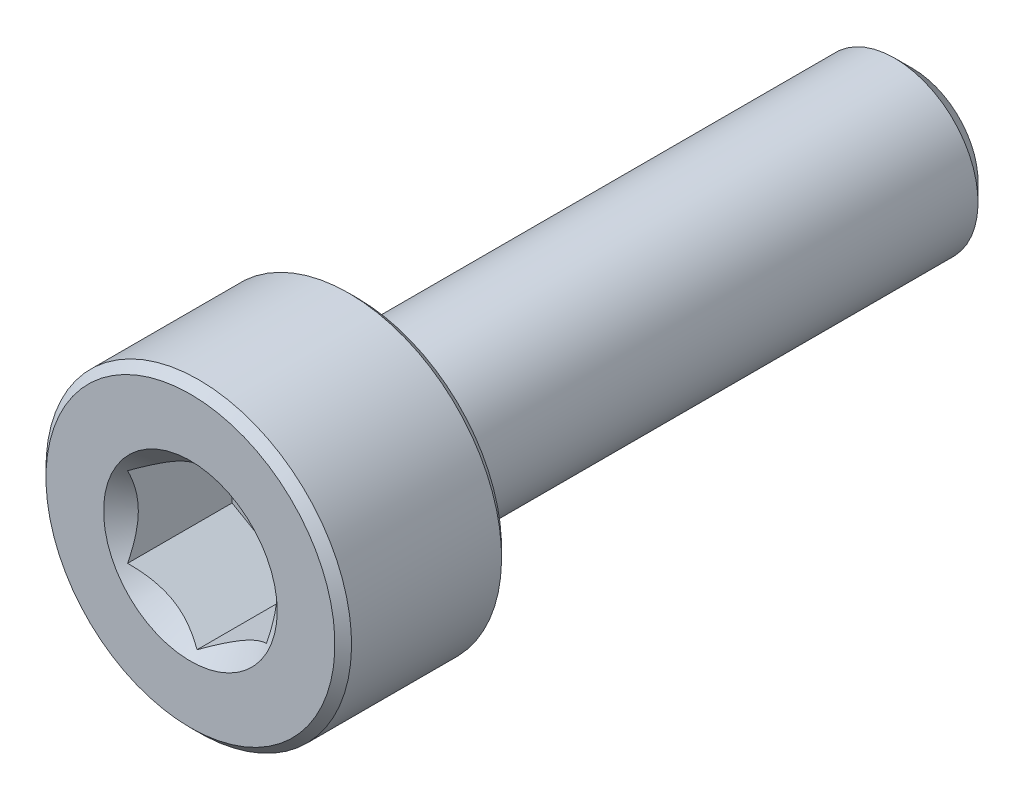
ISO-10303-21;
HEADER;
FILE_DESCRIPTION(('STEP AP214'),'2;1');
FILE_NAME('part.step','',(''),(''),'','','');
FILE_SCHEMA(('AUTOMOTIVE_DESIGN { 1 0 10303 214 1 1 1 1 }'));
ENDSEC;
DATA;
#1=APPLICATION_CONTEXT('core data for automotive mechanical design processes');
#2=APPLICATION_PROTOCOL_DEFINITION('international standard','automotive_design',2000,#1);
#3=PRODUCT_CONTEXT('',#1,'mechanical');
#4=PRODUCT('Part','Part','',(#3));
#5=PRODUCT_RELATED_PRODUCT_CATEGORY('part','',(#4));
#6=PRODUCT_DEFINITION_FORMATION('','',#4);
#7=PRODUCT_DEFINITION_CONTEXT('part definition',#1,'design');
#8=PRODUCT_DEFINITION('design','',#6,#7);
#9=PRODUCT_DEFINITION_SHAPE('','',#8);
#10=(LENGTH_UNIT() NAMED_UNIT(*) SI_UNIT(.MILLI.,.METRE.));
#11=(NAMED_UNIT(*) PLANE_ANGLE_UNIT() SI_UNIT($,.RADIAN.));
#12=(NAMED_UNIT(*) SI_UNIT($,.STERADIAN.) SOLID_ANGLE_UNIT());
#13=UNCERTAINTY_MEASURE_WITH_UNIT(LENGTH_MEASURE(1.E-05),#10,'distance_accuracy_value','');
#14=(GEOMETRIC_REPRESENTATION_CONTEXT(3) GLOBAL_UNCERTAINTY_ASSIGNED_CONTEXT((#13)) GLOBAL_UNIT_ASSIGNED_CONTEXT((#10,
#11,#12)) REPRESENTATION_CONTEXT('',''));
#15=CARTESIAN_POINT('',(0.,0.,0.));
#16=DIRECTION('',(0.,0.,1.));
#17=DIRECTION('',(1.,0.,0.));
#18=AXIS2_PLACEMENT_3D('',#15,#16,#17);
#19=CARTESIAN_POINT('',(0.,1.17524047358084,-6.5));
#20=DIRECTION('',(0.,0.,-1.));
#21=DIRECTION('',(0.,1.,0.));
#22=AXIS2_PLACEMENT_3D('',#19,#20,#21);
#23=PLANE('',#22);
#24=CARTESIAN_POINT('',(0.,0.,-6.5));
#25=DIRECTION('',(0.,0.,-1.));
#26=DIRECTION('',(0.,1.,0.));
#27=AXIS2_PLACEMENT_3D('',#24,#25,#26);
#28=CIRCLE('',#27,1.17524047358084);
#29=CARTESIAN_POINT('',(0.,1.17524047358084,-6.5));
#30=VERTEX_POINT('',#29);
#31=EDGE_CURVE('E55',#30,#30,#28,.T.);
#32=ORIENTED_EDGE('',*,*,#31,.T.);
#33=EDGE_LOOP('',(#32));
#34=FACE_BOUND('',#33,.T.);
#35=ADVANCED_FACE('F42',(#34),#23,.T.);
#36=CARTESIAN_POINT('',(0.,0.,-6.5));
#37=DIRECTION('',(0.,0.,1.));
#38=DIRECTION('',(0.,-1.,0.));
#39=AXIS2_PLACEMENT_3D('',#36,#37,#38);
#40=CONICAL_SURFACE('',#39,1.17524047358084,0.785398163397448);
#41=CARTESIAN_POINT('',(0.,0.,-6.17524047358084));
#42=DIRECTION('',(0.,0.,-1.));
#43=DIRECTION('',(0.,1.,0.));
#44=AXIS2_PLACEMENT_3D('',#41,#42,#43);
#45=CIRCLE('',#44,1.5);
#46=CARTESIAN_POINT('',(0.,1.5,-6.17524047358084));
#47=VERTEX_POINT('',#46);
#48=EDGE_CURVE('E158',#47,#47,#45,.T.);
#49=ORIENTED_EDGE('',*,*,#48,.T.);
#50=EDGE_LOOP('',(#49));
#51=FACE_BOUND('',#50,.T.);
#52=ORIENTED_EDGE('',*,*,#31,.F.);
#53=EDGE_LOOP('',(#52));
#54=FACE_BOUND('',#53,.T.);
#55=ADVANCED_FACE('F164',(#51,#54),#40,.T.);
#56=CARTESIAN_POINT('',(0.,0.,-6.5));
#57=DIRECTION('',(0.,0.,-1.));
#58=DIRECTION('',(0.,1.,0.));
#59=AXIS2_PLACEMENT_3D('',#56,#57,#58);
#60=CYLINDRICAL_SURFACE('',#59,1.5);
#61=CARTESIAN_POINT('',(0.,0.,3.35));
#62=DIRECTION('',(0.,0.,-1.));
#63=DIRECTION('',(0.,1.,0.));
#64=AXIS2_PLACEMENT_3D('',#61,#62,#63);
#65=CIRCLE('',#64,1.5);
#66=CARTESIAN_POINT('',(0.,1.5,3.35));
#67=VERTEX_POINT('',#66);
#68=EDGE_CURVE('E155',#67,#67,#65,.T.);
#69=ORIENTED_EDGE('',*,*,#68,.T.);
#70=EDGE_LOOP('',(#69));
#71=FACE_BOUND('',#70,.T.);
#72=ORIENTED_EDGE('',*,*,#48,.F.);
#73=EDGE_LOOP('',(#72));
#74=FACE_BOUND('',#73,.T.);
#75=ADVANCED_FACE('F166',(#71,#74),#60,.T.);
#76=CARTESIAN_POINT('',(0.,0.,3.35));
#77=DIRECTION('',(0.,0.,-1.));
#78=DIRECTION('',(0.,1.,0.));
#79=AXIS2_PLACEMENT_3D('',#76,#77,#78);
#80=TOROIDAL_SURFACE('',#79,1.65,0.15);
#81=CARTESIAN_POINT('',(0.,0.,3.5));
#82=DIRECTION('',(0.,0.,-1.));
#83=DIRECTION('',(0.,1.,0.));
#84=AXIS2_PLACEMENT_3D('',#81,#82,#83);
#85=CIRCLE('',#84,1.65);
#86=CARTESIAN_POINT('',(0.,1.65,3.5));
#87=VERTEX_POINT('',#86);
#88=EDGE_CURVE('E152',#87,#87,#85,.T.);
#89=ORIENTED_EDGE('',*,*,#88,.T.);
#90=EDGE_LOOP('',(#89));
#91=FACE_BOUND('',#90,.T.);
#92=ORIENTED_EDGE('',*,*,#68,.F.);
#93=EDGE_LOOP('',(#92));
#94=FACE_BOUND('',#93,.T.);
#95=ADVANCED_FACE('F172',(#91,#94),#80,.F.);
#96=CARTESIAN_POINT('',(0.,2.6,3.5));
#97=DIRECTION('',(0.,0.,-1.));
#98=DIRECTION('',(0.,1.,0.));
#99=AXIS2_PLACEMENT_3D('',#96,#97,#98);
#100=PLANE('',#99);
#101=CARTESIAN_POINT('',(0.,0.,3.5));
#102=DIRECTION('',(0.,0.,-1.));
#103=DIRECTION('',(0.,1.,0.));
#104=AXIS2_PLACEMENT_3D('',#101,#102,#103);
#105=CIRCLE('',#104,2.6);
#106=CARTESIAN_POINT('',(0.,2.6,3.5));
#107=VERTEX_POINT('',#106);
#108=EDGE_CURVE('E149',#107,#107,#105,.T.);
#109=ORIENTED_EDGE('',*,*,#108,.T.);
#110=EDGE_LOOP('',(#109));
#111=FACE_BOUND('',#110,.T.);
#112=ORIENTED_EDGE('',*,*,#88,.F.);
#113=EDGE_LOOP('',(#112));
#114=FACE_BOUND('',#113,.T.);
#115=ADVANCED_FACE('F178',(#111,#114),#100,.T.);
#116=CARTESIAN_POINT('',(0.,0.,3.5));
#117=DIRECTION('',(0.,0.,1.));
#118=DIRECTION('',(0.,-1.,0.));
#119=AXIS2_PLACEMENT_3D('',#116,#117,#118);
#120=CONICAL_SURFACE('',#119,2.6,0.785398163397445);
#121=CARTESIAN_POINT('',(0.,0.,3.65));
#122=DIRECTION('',(0.,0.,-1.));
#123=DIRECTION('',(0.,1.,0.));
#124=AXIS2_PLACEMENT_3D('',#121,#122,#123);
#125=CIRCLE('',#124,2.75);
#126=CARTESIAN_POINT('',(0.,2.75,3.65));
#127=VERTEX_POINT('',#126);
#128=EDGE_CURVE('E146',#127,#127,#125,.T.);
#129=ORIENTED_EDGE('',*,*,#128,.T.);
#130=EDGE_LOOP('',(#129));
#131=FACE_BOUND('',#130,.T.);
#132=ORIENTED_EDGE('',*,*,#108,.F.);
#133=EDGE_LOOP('',(#132));
#134=FACE_BOUND('',#133,.T.);
#135=ADVANCED_FACE('F182',(#131,#134),#120,.T.);
#136=CARTESIAN_POINT('',(0.,0.,-6.5));
#137=DIRECTION('',(0.,0.,-1.));
#138=DIRECTION('',(0.,1.,0.));
#139=AXIS2_PLACEMENT_3D('',#136,#137,#138);
#140=CYLINDRICAL_SURFACE('',#139,2.75);
#141=CARTESIAN_POINT('',(0.,0.,6.35));
#142=DIRECTION('',(0.,0.,-1.));
#143=DIRECTION('',(0.,1.,0.));
#144=AXIS2_PLACEMENT_3D('',#141,#142,#143);
#145=CIRCLE('',#144,2.75);
#146=CARTESIAN_POINT('',(0.,2.75,6.35));
#147=VERTEX_POINT('',#146);
#148=EDGE_CURVE('E143',#147,#147,#145,.T.);
#149=ORIENTED_EDGE('',*,*,#148,.T.);
#150=EDGE_LOOP('',(#149));
#151=FACE_BOUND('',#150,.T.);
#152=ORIENTED_EDGE('',*,*,#128,.F.);
#153=EDGE_LOOP('',(#152));
#154=FACE_BOUND('',#153,.T.);
#155=ADVANCED_FACE('F186',(#151,#154),#140,.T.);
#156=CARTESIAN_POINT('',(0.,0.,6.35));
#157=DIRECTION('',(0.,0.,-1.));
#158=DIRECTION('',(0.,1.,0.));
#159=AXIS2_PLACEMENT_3D('',#156,#157,#158);
#160=CONICAL_SURFACE('',#159,2.75,0.785398163397451);
#161=CARTESIAN_POINT('',(0.,0.,6.5));
#162=DIRECTION('',(0.,0.,-1.));
#163=DIRECTION('',(0.,1.,0.));
#164=AXIS2_PLACEMENT_3D('',#161,#162,#163);
#165=CIRCLE('',#164,2.6);
#166=CARTESIAN_POINT('',(0.,2.6,6.5));
#167=VERTEX_POINT('',#166);
#168=EDGE_CURVE('E140',#167,#167,#165,.T.);
#169=ORIENTED_EDGE('',*,*,#168,.T.);
#170=EDGE_LOOP('',(#169));
#171=FACE_BOUND('',#170,.T.);
#172=ORIENTED_EDGE('',*,*,#148,.F.);
#173=EDGE_LOOP('',(#172));
#174=FACE_BOUND('',#173,.T.);
#175=ADVANCED_FACE('F190',(#171,#174),#160,.T.);
#176=CARTESIAN_POINT('',(0.,0.,6.5));
#177=DIRECTION('',(0.,0.,1.));
#178=DIRECTION('',(0.,-1.,0.));
#179=AXIS2_PLACEMENT_3D('',#176,#177,#178);
#180=PLANE('',#179);
#181=CARTESIAN_POINT('',(0.,0.,6.5));
#182=DIRECTION('',(0.,0.,1.));
#183=DIRECTION('',(1.,0.,0.));
#184=AXIS2_PLACEMENT_3D('',#181,#182,#183);
#185=CIRCLE('',#184,1.5625);
#186=CARTESIAN_POINT('',(1.5625,0.,6.5));
#187=VERTEX_POINT('',#186);
#188=EDGE_CURVE('E114',#187,#187,#185,.T.);
#189=ORIENTED_EDGE('',*,*,#188,.F.);
#190=EDGE_LOOP('',(#189));
#191=FACE_BOUND('',#190,.T.);
#192=ORIENTED_EDGE('',*,*,#168,.F.);
#193=EDGE_LOOP('',(#192));
#194=FACE_BOUND('',#193,.T.);
#195=ADVANCED_FACE('F194',(#191,#194),#180,.T.);
#196=CARTESIAN_POINT('',(0.,0.,6.5));
#197=DIRECTION('',(0.,0.,1.));
#198=DIRECTION('',(1.,0.,0.));
#199=AXIS2_PLACEMENT_3D('',#196,#197,#198);
#200=CONICAL_SURFACE('',#199,1.5625,0.78539816339745);
#201=ORIENTED_EDGE('',*,*,#188,.T.);
#202=EDGE_LOOP('',(#201));
#203=FACE_BOUND('',#202,.T.);
#204=CARTESIAN_POINT('',(-0.000200000000000217,-1.4434911430279,6.3809911568832));
#205=CARTESIAN_POINT('',(0.0427751670715865,-1.41867941875065,6.35619734102917));
#206=CARTESIAN_POINT('',(0.0864690047459478,-1.39345276980743,6.33285940739275));
#207=CARTESIAN_POINT('',(0.175565930841942,-1.34201263554194,6.2901276770586));
#208=CARTESIAN_POINT('',(0.220977498357064,-1.31579425481276,6.27075766533448));
#209=CARTESIAN_POINT('',(0.312547820935259,-1.26292610442246,6.23757615638754));
#210=CARTESIAN_POINT('',(0.358683240175885,-1.23628980770471,6.22368123202672));
#211=CARTESIAN_POINT('',(0.451970080407592,-1.18243062538508,6.2022729551347));
#212=CARTESIAN_POINT('',(0.49911864913638,-1.15520938653761,6.19474361454085));
#213=CARTESIAN_POINT('',(0.580373556887252,-1.10829684367467,6.18795017102477));
#214=CARTESIAN_POINT('',(0.614374876627941,-1.08866617256958,6.18694423207842));
#215=CARTESIAN_POINT('',(0.682317764432477,-1.04943932800611,6.18863708788538));
#216=CARTESIAN_POINT('',(0.716259317655657,-1.02984316311599,6.1913367001896));
#217=CARTESIAN_POINT('',(0.783814856457499,-0.990839954603499,6.20028460329044));
#218=CARTESIAN_POINT('',(0.817428507286775,-0.971433104248771,6.20653619887377));
#219=CARTESIAN_POINT('',(0.884094638217813,-0.932943395609905,6.22225135438797));
#220=CARTESIAN_POINT('',(0.917146871030295,-0.9138606800983,6.23171629306152));
#221=CARTESIAN_POINT('',(1.00179969160026,-0.864986351354568,6.25980706366165));
#222=CARTESIAN_POINT('',(1.05286649242964,-0.835502920149076,6.28054583042627));
#223=CARTESIAN_POINT('',(1.15300085411325,-0.777690319475909,6.32726280764554));
#224=CARTESIAN_POINT('',(1.20207431157827,-0.749357745598417,6.35322396892083));
#225=CARTESIAN_POINT('',(1.2502,-0.721572366433195,6.3809911568832));
#226=B_SPLINE_CURVE_WITH_KNOTS('',3,(#204,#205,#206,#207,#208,#209,#210,#211,#212,#213,#214,
#215,#216,#217,#218,#219,#220,#221,#222,#223,#224,#225),.UNSPECIFIED.,.F.,.F.,(4,2,2,2,2,2,2,2,
2,2,4),(0.,0.166533409618304,0.334037607289762,0.498880396489698,0.663307919240275,
0.780963963458827,0.898645970148453,1.01643764860773,1.1342799317155,1.32148652032141,
1.50809158792574),.UNSPECIFIED.);
#227=CARTESIAN_POINT('',(0.,-1.44337567297406,6.38087567297407));
#228=VERTEX_POINT('',#227);
#229=CARTESIAN_POINT('',(1.25,-0.721687836487032,6.38087567297406));
#230=VERTEX_POINT('',#229);
#231=EDGE_CURVE('E12',#228,#230,#226,.T.);
#232=ORIENTED_EDGE('',*,*,#231,.F.);
#233=CARTESIAN_POINT('',(-1.2502,-0.721572366433195,6.3809911568832));
#234=CARTESIAN_POINT('',(-1.20722483292841,-0.746384090710444,6.35619734102917));
#235=CARTESIAN_POINT('',(-1.16353099525405,-0.771610739653665,6.33285940739275));
#236=CARTESIAN_POINT('',(-1.07443406915806,-0.823050873919155,6.2901276770586));
#237=CARTESIAN_POINT('',(-1.02902250164294,-0.849269254648333,6.27075766533448));
#238=CARTESIAN_POINT('',(-0.937452179064741,-0.902137405038636,6.23757615638754));
#239=CARTESIAN_POINT('',(-0.891316759824115,-0.928773701756387,6.22368123202672));
#240=CARTESIAN_POINT('',(-0.798029919592408,-0.982632884076013,6.2022729551347));
#241=CARTESIAN_POINT('',(-0.750881350863621,-1.00985412292348,6.19474361454085));
#242=CARTESIAN_POINT('',(-0.669626443112748,-1.05676666578643,6.18795017102477));
#243=CARTESIAN_POINT('',(-0.63562512337206,-1.07639733689152,6.18694423207842));
#244=CARTESIAN_POINT('',(-0.567682235567523,-1.11562418145499,6.18863708788538));
#245=CARTESIAN_POINT('',(-0.533740682344343,-1.1352203463451,6.1913367001896));
#246=CARTESIAN_POINT('',(-0.466185143542501,-1.1742235548576,6.20028460329044));
#247=CARTESIAN_POINT('',(-0.432571492713226,-1.19363040521233,6.20653619887377));
#248=CARTESIAN_POINT('',(-0.365905361782187,-1.23212011385119,6.22225135438797));
#249=CARTESIAN_POINT('',(-0.332853128969705,-1.2512028293628,6.23171629306152));
#250=CARTESIAN_POINT('',(-0.248200308399736,-1.30007715810653,6.25980706366165));
#251=CARTESIAN_POINT('',(-0.197133507570362,-1.32956058931202,6.28054583042627));
#252=CARTESIAN_POINT('',(-0.0969991458867452,-1.38737318998519,6.32726280764554));
#253=CARTESIAN_POINT('',(-0.0479256884217306,-1.41570576386268,6.35322396892083));
#254=CARTESIAN_POINT('',(0.000199999999999947,-1.4434911430279,6.3809911568832));
#255=B_SPLINE_CURVE_WITH_KNOTS('',3,(#233,#234,#235,#236,#237,#238,#239,#240,#241,#242,#243,
#244,#245,#246,#247,#248,#249,#250,#251,#252,#253,#254),.UNSPECIFIED.,.F.,.F.,(4,2,2,2,2,2,2,2,
2,2,4),(0.,0.166533409618304,0.334037607289761,0.498880396489698,0.663307919240274,
0.780963963458826,0.898645970148453,1.01643764860773,1.13427993171549,1.32148652032141,
1.50809158792574),.UNSPECIFIED.);
#256=CARTESIAN_POINT('',(-1.25,-0.721687836487033,6.38087567297407));
#257=VERTEX_POINT('',#256);
#258=EDGE_CURVE('E100',#257,#228,#255,.T.);
#259=ORIENTED_EDGE('',*,*,#258,.F.);
#260=CARTESIAN_POINT('',(-1.25,-1.52906039618109,6.91247485937656));
#261=CARTESIAN_POINT('',(-1.25,-1.49220529080579,6.88394520440545));
#262=CARTESIAN_POINT('',(-1.25,-1.45515496684494,6.85566856788859));
#263=CARTESIAN_POINT('',(-1.25,-1.38058140838662,6.79972834081338));
#264=CARTESIAN_POINT('',(-1.25,-1.34305806621138,6.77206489394419));
#265=CARTESIAN_POINT('',(-1.25,-1.22910675079842,6.68976023403817));
#266=CARTESIAN_POINT('',(-1.25,-1.15185483124782,6.63624146268623));
#267=CARTESIAN_POINT('',(-1.25,-0.989252377816229,6.53031168703532));
#268=CARTESIAN_POINT('',(-1.25,-0.903702856150538,6.47820301658353));
#269=CARTESIAN_POINT('',(-1.25,-0.728224302589146,6.38229295817095));
#270=CARTESIAN_POINT('',(-1.25,-0.638311408271527,6.33846351429438));
#271=CARTESIAN_POINT('',(-1.25,-0.504179528176994,6.28481796944124));
#272=CARTESIAN_POINT('',(-1.25,-0.462140309604463,6.26958311655924));
#273=CARTESIAN_POINT('',(-1.25,-0.376968358930113,6.24248027967488));
#274=CARTESIAN_POINT('',(-1.25,-0.333835559023207,6.23061250499961));
#275=CARTESIAN_POINT('',(-1.25,-0.247500786382209,6.21108793058396));
#276=CARTESIAN_POINT('',(-1.25,-0.204316746020218,6.20335314062603));
#277=CARTESIAN_POINT('',(-1.25,-0.117386820033729,6.19226051149026));
#278=CARTESIAN_POINT('',(-1.25,-0.0736410606163113,6.18890170591012));
#279=CARTESIAN_POINT('',(-1.25,0.0119255032765034,6.18685912442193));
#280=CARTESIAN_POINT('',(-1.25,0.053741325018926,6.18796541806101));
#281=CARTESIAN_POINT('',(-1.25,0.137056635467403,6.19430478308355));
#282=CARTESIAN_POINT('',(-1.25,0.178556095869134,6.19953821944029));
#283=CARTESIAN_POINT('',(-1.25,0.261643418190125,6.21392095567136));
#284=CARTESIAN_POINT('',(-1.25,0.303218962688244,6.22314026055592));
#285=CARTESIAN_POINT('',(-1.25,0.385447906554256,6.24497795035777));
#286=CARTESIAN_POINT('',(-1.25,0.426101349364106,6.25759617478337));
#287=CARTESIAN_POINT('',(-1.25,0.55031875610095,6.30099995648882));
#288=CARTESIAN_POINT('',(-1.25,0.632206913819509,6.33656592610618));
#289=CARTESIAN_POINT('',(-1.25,0.792163832901716,6.41573000476451));
#290=CARTESIAN_POINT('',(-1.25,0.870217968244436,6.45935624183847));
#291=CARTESIAN_POINT('',(-1.25,1.01943092253057,6.54945332591182));
#292=CARTESIAN_POINT('',(-1.25,1.09074002929845,6.59567842626371));
#293=CARTESIAN_POINT('',(-1.25,1.19579897437392,6.66717891685916));
#294=CARTESIAN_POINT('',(-1.25,1.23036719648395,6.69127266485707));
#295=CARTESIAN_POINT('',(-1.25,1.29902897795883,6.7401082209343));
#296=CARTESIAN_POINT('',(-1.25,1.33312266558282,6.7648498484799));
#297=CARTESIAN_POINT('',(-1.25,1.36701837723592,6.78986045188314));
#298=B_SPLINE_CURVE_WITH_KNOTS('',3,(#260,#261,#262,#263,#264,#265,#266,#267,#268,#269,#270,
#271,#272,#273,#274,#275,#276,#277,#278,#279,#280,#281,#282,#283,#284,#285,#286,#287,#288,#289,
#290,#291,#292,#293,#294,#295,#296,#297),.UNSPECIFIED.,.F.,.F.,(4,2,2,2,2,2,2,2,2,2,2,2,2,2,2,2,
2,2,4),(0.,0.139818578617194,0.279669581865358,0.561494750208464,0.861785235472754,
1.16103911347106,1.29507141697469,1.42911205127607,1.56052497981098,1.69190888189515,
1.81718933044287,1.94248085908789,2.0700684972633,2.19765011200548,2.46470732734004,
2.73271472961997,2.98752909358604,3.11393310607498,3.24030226282947),.UNSPECIFIED.);
#299=CARTESIAN_POINT('',(-1.25,0.721687836487033,6.38087567297407));
#300=VERTEX_POINT('',#299);
#301=EDGE_CURVE('E113',#300,#257,#298,.F.);
#302=ORIENTED_EDGE('',*,*,#301,.F.);
#303=CARTESIAN_POINT('',(0.00019999999999965,1.4434911430279,6.3809911568832));
#304=CARTESIAN_POINT('',(-0.042775167071587,1.41867941875065,6.35619734102917));
#305=CARTESIAN_POINT('',(-0.0864690047459483,1.39345276980743,6.33285940739275));
#306=CARTESIAN_POINT('',(-0.175565930841942,1.34201263554194,6.2901276770586));
#307=CARTESIAN_POINT('',(-0.220977498357064,1.31579425481276,6.27075766533448));
#308=CARTESIAN_POINT('',(-0.31254782093526,1.26292610442246,6.23757615638754));
#309=CARTESIAN_POINT('',(-0.358683240175885,1.23628980770471,6.22368123202672));
#310=CARTESIAN_POINT('',(-0.451970080407592,1.18243062538508,6.2022729551347));
#311=CARTESIAN_POINT('',(-0.499118649136379,1.15520938653761,6.19474361454085));
#312=CARTESIAN_POINT('',(-0.580373556887252,1.10829684367467,6.18795017102477));
#313=CARTESIAN_POINT('',(-0.61437487662794,1.08866617256958,6.18694423207842));
#314=CARTESIAN_POINT('',(-0.682317764432477,1.04943932800611,6.18863708788539));
#315=CARTESIAN_POINT('',(-0.716259317655657,1.02984316311599,6.1913367001896));
#316=CARTESIAN_POINT('',(-0.783814856457499,0.9908399546035,6.20028460329044));
#317=CARTESIAN_POINT('',(-0.817428507286775,0.971433104248772,6.20653619887377));
#318=CARTESIAN_POINT('',(-0.884094638217813,0.932943395609906,6.22225135438797));
#319=CARTESIAN_POINT('',(-0.917146871030295,0.913860680098301,6.23171629306152));
#320=CARTESIAN_POINT('',(-1.00179969160026,0.864986351354569,6.25980706366165));
#321=CARTESIAN_POINT('',(-1.05286649242964,0.835502920149077,6.28054583042627));
#322=CARTESIAN_POINT('',(-1.15300085411326,0.777690319475909,6.32726280764554));
#323=CARTESIAN_POINT('',(-1.20207431157827,0.749357745598417,6.35322396892083));
#324=CARTESIAN_POINT('',(-1.2502,0.721572366433195,6.3809911568832));
#325=B_SPLINE_CURVE_WITH_KNOTS('',3,(#303,#304,#305,#306,#307,#308,#309,#310,#311,#312,#313,
#314,#315,#316,#317,#318,#319,#320,#321,#322,#323,#324),.UNSPECIFIED.,.F.,.F.,(4,2,2,2,2,2,2,2,
2,2,4),(0.,0.166533409618304,0.334037607289761,0.498880396489697,0.663307919240273,
0.780963963458826,0.898645970148452,1.01643764860773,1.13427993171549,1.32148652032141,
1.50809158792573),.UNSPECIFIED.);
#326=CARTESIAN_POINT('',(0.,1.44337567297407,6.38087567297407));
#327=VERTEX_POINT('',#326);
#328=EDGE_CURVE('E244',#327,#300,#325,.T.);
#329=ORIENTED_EDGE('',*,*,#328,.F.);
#330=CARTESIAN_POINT('',(1.2502,0.721572366433195,6.3809911568832));
#331=CARTESIAN_POINT('',(1.20722483292841,0.746384090710445,6.35619734102917));
#332=CARTESIAN_POINT('',(1.16353099525405,0.771610739653665,6.33285940739275));
#333=CARTESIAN_POINT('',(1.07443406915806,0.823050873919156,6.2901276770586));
#334=CARTESIAN_POINT('',(1.02902250164294,0.849269254648334,6.27075766533448));
#335=CARTESIAN_POINT('',(0.93745217906474,0.902137405038636,6.23757615638754));
#336=CARTESIAN_POINT('',(0.891316759824114,0.928773701756388,6.22368123202672));
#337=CARTESIAN_POINT('',(0.798029919592408,0.982632884076013,6.2022729551347));
#338=CARTESIAN_POINT('',(0.75088135086362,1.00985412292348,6.19474361454085));
#339=CARTESIAN_POINT('',(0.669626443112748,1.05676666578643,6.18795017102477));
#340=CARTESIAN_POINT('',(0.635625123372059,1.07639733689152,6.18694423207842));
#341=CARTESIAN_POINT('',(0.567682235567523,1.11562418145499,6.18863708788539));
#342=CARTESIAN_POINT('',(0.533740682344343,1.1352203463451,6.1913367001896));
#343=CARTESIAN_POINT('',(0.466185143542501,1.1742235548576,6.20028460329044));
#344=CARTESIAN_POINT('',(0.432571492713225,1.19363040521233,6.20653619887377));
#345=CARTESIAN_POINT('',(0.365905361782187,1.23212011385119,6.22225135438797));
#346=CARTESIAN_POINT('',(0.332853128969705,1.2512028293628,6.23171629306152));
#347=CARTESIAN_POINT('',(0.248200308399736,1.30007715810653,6.25980706366165));
#348=CARTESIAN_POINT('',(0.197133507570362,1.32956058931202,6.28054583042627));
#349=CARTESIAN_POINT('',(0.096999145886745,1.38737318998519,6.32726280764554));
#350=CARTESIAN_POINT('',(0.0479256884217303,1.41570576386268,6.35322396892083));
#351=CARTESIAN_POINT('',(-0.000200000000000256,1.4434911430279,6.3809911568832));
#352=B_SPLINE_CURVE_WITH_KNOTS('',3,(#330,#331,#332,#333,#334,#335,#336,#337,#338,#339,#340,
#341,#342,#343,#344,#345,#346,#347,#348,#349,#350,#351),.UNSPECIFIED.,.F.,.F.,(4,2,2,2,2,2,2,2,
2,2,4),(0.,0.166533409618303,0.334037607289761,0.498880396489697,0.663307919240274,
0.780963963458826,0.898645970148452,1.01643764860773,1.13427993171549,1.32148652032141,
1.50809158792573),.UNSPECIFIED.);
#353=CARTESIAN_POINT('',(1.25,0.721687836487033,6.38087567297407));
#354=VERTEX_POINT('',#353);
#355=EDGE_CURVE('E217',#354,#327,#352,.T.);
#356=ORIENTED_EDGE('',*,*,#355,.F.);
#357=CARTESIAN_POINT('',(1.25,-1.52905951307294,6.91247417565872));
#358=CARTESIAN_POINT('',(1.25,-1.49220443340975,6.88394454719035));
#359=CARTESIAN_POINT('',(1.25,-1.45515413523639,6.85566793713426));
#360=CARTESIAN_POINT('',(1.25,-1.38058062859442,6.79972776283032));
#361=CARTESIAN_POINT('',(1.25,-1.34305731244813,6.77206434227156));
#362=CARTESIAN_POINT('',(1.25,-1.22910607665359,6.68975976182298));
#363=CARTESIAN_POINT('',(1.25,-1.15185421119604,6.63624104323767));
#364=CARTESIAN_POINT('',(1.25,-0.98925187584104,6.53031137662917));
#365=CARTESIAN_POINT('',(1.25,-0.903702418475842,6.47820276205999));
#366=CARTESIAN_POINT('',(1.25,-0.72822399892133,6.38229280746302));
#367=CARTESIAN_POINT('',(1.25,-0.638311174264586,6.33846341158793));
#368=CARTESIAN_POINT('',(1.25,-0.504179346124884,6.28481790068269));
#369=CARTESIAN_POINT('',(1.25,-0.462140104878465,6.26958304479528));
#370=CARTESIAN_POINT('',(1.25,-0.376968107935322,6.24248020642936));
#371=CARTESIAN_POINT('',(1.25,-0.333835284434423,6.23061243327523));
#372=CARTESIAN_POINT('',(1.25,-0.247500465304423,6.21108786739434));
#373=CARTESIAN_POINT('',(1.25,-0.204316402067131,6.20335308428999));
#374=CARTESIAN_POINT('',(1.25,-0.117386430899383,6.19226047426314));
#375=CARTESIAN_POINT('',(1.25,-0.0736406491759952,6.1889016809363));
#376=CARTESIAN_POINT('',(1.25,0.0119259518544277,6.18685912816713));
#377=CARTESIAN_POINT('',(1.25,0.053741788486036,6.18796543755722));
#378=CARTESIAN_POINT('',(1.25,0.137057126970277,6.1943048362587));
#379=CARTESIAN_POINT('',(1.25,0.178556600518281,6.19953829054549));
#380=CARTESIAN_POINT('',(1.25,0.261643948783009,6.21392106408938));
#381=CARTESIAN_POINT('',(1.25,0.303219506029026,6.22314038847805));
#382=CARTESIAN_POINT('',(1.25,0.385448473975618,6.2449781174263));
#383=CARTESIAN_POINT('',(1.25,0.426101928118348,6.2575963614937));
#384=CARTESIAN_POINT('',(1.25,0.550319456992717,6.30100023399784));
#385=CARTESIAN_POINT('',(1.25,0.632207719380867,6.33656628684844));
#386=CARTESIAN_POINT('',(1.25,0.792164839741488,6.41573054123008));
#387=CARTESIAN_POINT('',(1.25,0.8702190716438,6.45935687085997));
#388=CARTESIAN_POINT('',(1.25,1.01943219916295,6.54945413200827));
#389=CARTESIAN_POINT('',(1.25,1.09074138323722,6.59567931603778));
#390=CARTESIAN_POINT('',(1.25,1.19580044259576,6.6671799317142));
#391=CARTESIAN_POINT('',(1.25,1.23036870224718,6.69127372107415));
#392=CARTESIAN_POINT('',(1.25,1.29903055855592,6.74010935982246));
#393=CARTESIAN_POINT('',(1.25,1.33312428347233,6.76485102867727));
#394=CARTESIAN_POINT('',(1.25,1.36702003234981,6.78986167333641));
#395=B_SPLINE_CURVE_WITH_KNOTS('',3,(#357,#358,#359,#360,#361,#362,#363,#364,#365,#366,#367,
#368,#369,#370,#371,#372,#373,#374,#375,#376,#377,#378,#379,#380,#381,#382,#383,#384,#385,#386,
#387,#388,#389,#390,#391,#392,#393,#394),.UNSPECIFIED.,.F.,.F.,(4,2,2,2,2,2,2,2,2,2,2,2,2,2,2,2,
2,2,4),(0.,0.139818468955544,0.279669362509984,0.561494307361431,0.86178454072842,
1.1610381692749,1.29507053957457,1.42911124055678,1.56052423261168,1.69190819817627,
1.8171886924228,1.94248026682952,2.07006795499489,2.19764961970651,2.4647072208394,
2.73271501145679,2.98752970662837,3.11393388247469,3.24030320257251),.UNSPECIFIED.);
#396=EDGE_CURVE('E62',#230,#354,#395,.T.);
#397=ORIENTED_EDGE('',*,*,#396,.F.);
#398=EDGE_LOOP('',(#232,#259,#302,#329,#356,#397));
#399=FACE_BOUND('',#398,.T.);
#400=ADVANCED_FACE('F99',(#203,#399),#200,.F.);
#401=CARTESIAN_POINT('',(0.,2.6,4.5));
#402=DIRECTION('',(0.,0.,-1.));
#403=DIRECTION('',(0.,1.,0.));
#404=AXIS2_PLACEMENT_3D('',#401,#402,#403);
#405=PLANE('',#404);
#406=DIRECTION('',(0.866025403784439,0.5,0.));
#407=VECTOR('',#406,1.);
#408=CARTESIAN_POINT('',(0.,-1.44337567297406,4.5));
#409=LINE('',#408,#407);
#410=CARTESIAN_POINT('',(0.,-1.44337567297406,4.5));
#411=VERTEX_POINT('',#410);
#412=CARTESIAN_POINT('',(1.25,-0.721687836487032,4.5));
#413=VERTEX_POINT('',#412);
#414=EDGE_CURVE('E117',#411,#413,#409,.T.);
#415=ORIENTED_EDGE('',*,*,#414,.T.);
#416=DIRECTION('',(0.,1.,0.));
#417=VECTOR('',#416,1.);
#418=CARTESIAN_POINT('',(1.25,-0.721687836487032,4.5));
#419=LINE('',#418,#417);
#420=CARTESIAN_POINT('',(1.25,0.721687836487033,4.5));
#421=VERTEX_POINT('',#420);
#422=EDGE_CURVE('E69',#413,#421,#419,.T.);
#423=ORIENTED_EDGE('',*,*,#422,.T.);
#424=DIRECTION('',(-0.866025403784439,0.5,0.));
#425=VECTOR('',#424,1.);
#426=CARTESIAN_POINT('',(1.25,0.721687836487033,4.5));
#427=LINE('',#426,#425);
#428=CARTESIAN_POINT('',(0.,1.44337567297407,4.5));
#429=VERTEX_POINT('',#428);
#430=EDGE_CURVE('E125',#421,#429,#427,.T.);
#431=ORIENTED_EDGE('',*,*,#430,.T.);
#432=DIRECTION('',(-0.866025403784439,-0.5,0.));
#433=VECTOR('',#432,1.);
#434=CARTESIAN_POINT('',(0.,1.44337567297407,4.5));
#435=LINE('',#434,#433);
#436=CARTESIAN_POINT('',(-1.25,0.721687836487033,4.5));
#437=VERTEX_POINT('',#436);
#438=EDGE_CURVE('E132',#429,#437,#435,.T.);
#439=ORIENTED_EDGE('',*,*,#438,.T.);
#440=DIRECTION('',(0.,-1.,0.));
#441=VECTOR('',#440,1.);
#442=CARTESIAN_POINT('',(-1.25,0.721687836487033,4.5));
#443=LINE('',#442,#441);
#444=CARTESIAN_POINT('',(-1.25,-0.721687836487033,4.5));
#445=VERTEX_POINT('',#444);
#446=EDGE_CURVE('E128',#437,#445,#443,.T.);
#447=ORIENTED_EDGE('',*,*,#446,.T.);
#448=DIRECTION('',(0.866025403784439,-0.5,0.));
#449=VECTOR('',#448,1.);
#450=CARTESIAN_POINT('',(-1.25,-0.721687836487033,4.5));
#451=LINE('',#450,#449);
#452=EDGE_CURVE('E118',#445,#411,#451,.T.);
#453=ORIENTED_EDGE('',*,*,#452,.T.);
#454=EDGE_LOOP('',(#415,#423,#431,#439,#447,#453));
#455=FACE_BOUND('',#454,.T.);
#456=ADVANCED_FACE('F199',(#455),#405,.F.);
#457=CARTESIAN_POINT('',(0.,-1.44337567297406,-0.318813079129868));
#458=DIRECTION('',(0.5,-0.866025403784439,0.));
#459=DIRECTION('',(0.866025403784439,0.5,0.));
#460=AXIS2_PLACEMENT_3D('',#457,#458,#459);
#461=PLANE('',#460);
#462=DIRECTION('',(0.,0.,1.));
#463=VECTOR('',#462,1.);
#464=CARTESIAN_POINT('',(0.,-1.44337567297406,-0.318813079129868));
#465=LINE('',#464,#463);
#466=EDGE_CURVE('E109',#411,#228,#465,.T.);
#467=ORIENTED_EDGE('',*,*,#466,.T.);
#468=ORIENTED_EDGE('',*,*,#231,.T.);
#469=DIRECTION('',(0.,0.,1.));
#470=VECTOR('',#469,1.);
#471=CARTESIAN_POINT('',(1.25,-0.721687836487032,-0.318813079129868));
#472=LINE('',#471,#470);
#473=EDGE_CURVE('E120',#413,#230,#472,.T.);
#474=ORIENTED_EDGE('',*,*,#473,.F.);
#475=ORIENTED_EDGE('',*,*,#414,.F.);
#476=EDGE_LOOP('',(#467,#468,#474,#475));
#477=FACE_BOUND('',#476,.T.);
#478=ADVANCED_FACE('F116',(#477),#461,.F.);
#479=CARTESIAN_POINT('',(-1.25,-0.721687836487033,-0.318813079129868));
#480=DIRECTION('',(-0.5,-0.866025403784439,0.));
#481=DIRECTION('',(0.866025403784439,-0.5,0.));
#482=AXIS2_PLACEMENT_3D('',#479,#480,#481);
#483=PLANE('',#482);
#484=DIRECTION('',(0.,0.,1.));
#485=VECTOR('',#484,1.);
#486=CARTESIAN_POINT('',(-1.25,-0.721687836487033,-0.318813079129868));
#487=LINE('',#486,#485);
#488=EDGE_CURVE('E112',#445,#257,#487,.T.);
#489=ORIENTED_EDGE('',*,*,#488,.T.);
#490=ORIENTED_EDGE('',*,*,#258,.T.);
#491=ORIENTED_EDGE('',*,*,#466,.F.);
#492=ORIENTED_EDGE('',*,*,#452,.F.);
#493=EDGE_LOOP('',(#489,#490,#491,#492));
#494=FACE_BOUND('',#493,.T.);
#495=ADVANCED_FACE('F108',(#494),#483,.F.);
#496=CARTESIAN_POINT('',(-1.25,0.721687836487033,-0.318813079129868));
#497=DIRECTION('',(-1.,0.,0.));
#498=DIRECTION('',(0.,-1.,0.));
#499=AXIS2_PLACEMENT_3D('',#496,#497,#498);
#500=PLANE('',#499);
#501=DIRECTION('',(0.,0.,1.));
#502=VECTOR('',#501,1.);
#503=CARTESIAN_POINT('',(-1.25,0.721687836487033,-0.318813079129868));
#504=LINE('',#503,#502);
#505=EDGE_CURVE('E129',#437,#300,#504,.T.);
#506=ORIENTED_EDGE('',*,*,#505,.T.);
#507=ORIENTED_EDGE('',*,*,#301,.T.);
#508=ORIENTED_EDGE('',*,*,#488,.F.);
#509=ORIENTED_EDGE('',*,*,#446,.F.);
#510=EDGE_LOOP('',(#506,#507,#508,#509));
#511=FACE_BOUND('',#510,.T.);
#512=ADVANCED_FACE('F253',(#511),#500,.F.);
#513=CARTESIAN_POINT('',(0.,1.44337567297407,-0.318813079129868));
#514=DIRECTION('',(-0.5,0.866025403784439,0.));
#515=DIRECTION('',(-0.866025403784439,-0.5,0.));
#516=AXIS2_PLACEMENT_3D('',#513,#514,#515);
#517=PLANE('',#516);
#518=DIRECTION('',(0.,0.,1.));
#519=VECTOR('',#518,1.);
#520=CARTESIAN_POINT('',(0.,1.44337567297407,-0.318813079129868));
#521=LINE('',#520,#519);
#522=EDGE_CURVE('E133',#429,#327,#521,.T.);
#523=ORIENTED_EDGE('',*,*,#522,.T.);
#524=ORIENTED_EDGE('',*,*,#328,.T.);
#525=ORIENTED_EDGE('',*,*,#505,.F.);
#526=ORIENTED_EDGE('',*,*,#438,.F.);
#527=EDGE_LOOP('',(#523,#524,#525,#526));
#528=FACE_BOUND('',#527,.T.);
#529=ADVANCED_FACE('F250',(#528),#517,.F.);
#530=CARTESIAN_POINT('',(1.25,0.721687836487033,-0.318813079129868));
#531=DIRECTION('',(0.5,0.866025403784439,0.));
#532=DIRECTION('',(-0.866025403784439,0.5,0.));
#533=AXIS2_PLACEMENT_3D('',#530,#531,#532);
#534=PLANE('',#533);
#535=DIRECTION('',(0.,0.,1.));
#536=VECTOR('',#535,1.);
#537=CARTESIAN_POINT('',(1.25,0.721687836487033,-0.318813079129868));
#538=LINE('',#537,#536);
#539=EDGE_CURVE('E136',#421,#354,#538,.T.);
#540=ORIENTED_EDGE('',*,*,#539,.T.);
#541=ORIENTED_EDGE('',*,*,#355,.T.);
#542=ORIENTED_EDGE('',*,*,#522,.F.);
#543=ORIENTED_EDGE('',*,*,#430,.F.);
#544=EDGE_LOOP('',(#540,#541,#542,#543));
#545=FACE_BOUND('',#544,.T.);
#546=ADVANCED_FACE('F207',(#545),#534,.F.);
#547=CARTESIAN_POINT('',(1.25,-0.721687836487032,-0.318813079129868));
#548=DIRECTION('',(1.,0.,0.));
#549=DIRECTION('',(0.,0.,-1.));
#550=AXIS2_PLACEMENT_3D('',#547,#548,#549);
#551=PLANE('',#550);
#552=ORIENTED_EDGE('',*,*,#473,.T.);
#553=ORIENTED_EDGE('',*,*,#396,.T.);
#554=ORIENTED_EDGE('',*,*,#539,.F.);
#555=ORIENTED_EDGE('',*,*,#422,.F.);
#556=EDGE_LOOP('',(#552,#553,#554,#555));
#557=FACE_BOUND('',#556,.T.);
#558=ADVANCED_FACE('F203',(#557),#551,.F.);
#559=CLOSED_SHELL('',(#35,#55,#75,#95,#115,#135,#155,#175,#195,#400,#456,#478,#495,#512,#529,
#546,#558));
#560=MANIFOLD_SOLID_BREP('B2',#559);
#561=ADVANCED_BREP_SHAPE_REPRESENTATION('',(#18,#560),#14);
#562=SHAPE_DEFINITION_REPRESENTATION(#9,#561);
ENDSEC;
END-ISO-10303-21;
